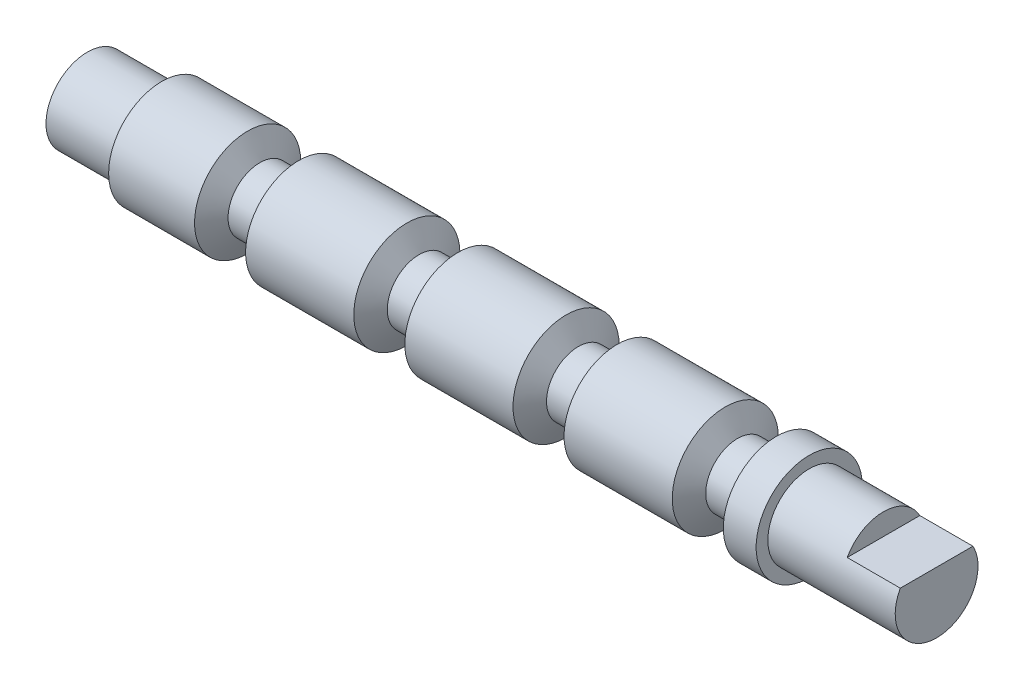
ISO-10303-21;
HEADER;
FILE_DESCRIPTION(('STEP AP214'),'2;1');
FILE_NAME('part.step','',(''),(''),'','','');
FILE_SCHEMA(('AUTOMOTIVE_DESIGN { 1 0 10303 214 1 1 1 1 }'));
ENDSEC;
DATA;
#1=APPLICATION_CONTEXT('core data for automotive mechanical design processes');
#2=APPLICATION_PROTOCOL_DEFINITION('international standard','automotive_design',2000,#1);
#3=PRODUCT_CONTEXT('',#1,'mechanical');
#4=PRODUCT('Part','Part','',(#3));
#5=PRODUCT_RELATED_PRODUCT_CATEGORY('part','',(#4));
#6=PRODUCT_DEFINITION_FORMATION('','',#4);
#7=PRODUCT_DEFINITION_CONTEXT('part definition',#1,'design');
#8=PRODUCT_DEFINITION('design','',#6,#7);
#9=PRODUCT_DEFINITION_SHAPE('','',#8);
#10=(LENGTH_UNIT() NAMED_UNIT(*) SI_UNIT(.MILLI.,.METRE.));
#11=(NAMED_UNIT(*) PLANE_ANGLE_UNIT() SI_UNIT($,.RADIAN.));
#12=(NAMED_UNIT(*) SI_UNIT($,.STERADIAN.) SOLID_ANGLE_UNIT());
#13=UNCERTAINTY_MEASURE_WITH_UNIT(LENGTH_MEASURE(1.E-05),#10,'distance_accuracy_value','');
#14=(GEOMETRIC_REPRESENTATION_CONTEXT(3) GLOBAL_UNCERTAINTY_ASSIGNED_CONTEXT((#13)) GLOBAL_UNIT_ASSIGNED_CONTEXT((#10,
#11,#12)) REPRESENTATION_CONTEXT('',''));
#15=CARTESIAN_POINT('',(0.,0.,0.));
#16=DIRECTION('',(0.,0.,1.));
#17=DIRECTION('',(1.,0.,0.));
#18=AXIS2_PLACEMENT_3D('',#15,#16,#17);
#19=CARTESIAN_POINT('',(40.,0.,5.));
#20=DIRECTION('',(1.,0.,0.));
#21=DIRECTION('',(0.,0.,-1.));
#22=AXIS2_PLACEMENT_3D('',#19,#20,#21);
#23=CYLINDRICAL_SURFACE('',#22,5.00000000000008);
#24=CARTESIAN_POINT('',(24.9047005383793,0.,5.));
#25=DIRECTION('',(1.,0.,0.));
#26=DIRECTION('',(0.,0.,-1.));
#27=AXIS2_PLACEMENT_3D('',#24,#25,#26);
#28=CIRCLE('',#27,5.);
#29=CARTESIAN_POINT('',(24.9047005383793,0.,0.));
#30=VERTEX_POINT('',#29);
#31=EDGE_CURVE('E112',#30,#30,#28,.T.);
#32=ORIENTED_EDGE('',*,*,#31,.T.);
#33=EDGE_LOOP('',(#32));
#34=FACE_BOUND('',#33,.T.);
#35=CARTESIAN_POINT('',(28.,0.,5.));
#36=DIRECTION('',(1.,0.,0.));
#37=DIRECTION('',(0.,0.,-1.));
#38=AXIS2_PLACEMENT_3D('',#35,#36,#37);
#39=CIRCLE('',#38,5.00000000000016);
#40=CARTESIAN_POINT('',(28.,0.,-1.64798730217797E-13));
#41=VERTEX_POINT('',#40);
#42=EDGE_CURVE('E93',#41,#41,#39,.T.);
#43=ORIENTED_EDGE('',*,*,#42,.F.);
#44=EDGE_LOOP('',(#43));
#45=FACE_BOUND('',#44,.T.);
#46=ADVANCED_FACE('F45',(#34,#45),#23,.T.);
#47=CARTESIAN_POINT('',(40.,0.,5.));
#48=DIRECTION('',(1.,0.,0.));
#49=DIRECTION('',(0.,0.,-1.));
#50=AXIS2_PLACEMENT_3D('',#47,#48,#49);
#51=CYLINDRICAL_SURFACE('',#50,5.);
#52=CARTESIAN_POINT('',(-24.9047005383792,0.,5.00000000000001));
#53=DIRECTION('',(1.,0.,0.));
#54=DIRECTION('',(0.,0.,-1.));
#55=AXIS2_PLACEMENT_3D('',#52,#53,#54);
#56=CIRCLE('',#55,5.);
#57=CARTESIAN_POINT('',(-24.9047005383792,0.,0.));
#58=VERTEX_POINT('',#57);
#59=EDGE_CURVE('E11',#58,#58,#56,.T.);
#60=ORIENTED_EDGE('',*,*,#59,.F.);
#61=EDGE_LOOP('',(#60));
#62=FACE_BOUND('',#61,.T.);
#63=CARTESIAN_POINT('',(-33.,0.,5.00000000000001));
#64=DIRECTION('',(-1.,0.,0.));
#65=DIRECTION('',(0.,0.,1.));
#66=AXIS2_PLACEMENT_3D('',#63,#64,#65);
#67=CIRCLE('',#66,5.00000000000017);
#68=CARTESIAN_POINT('',(-33.,0.,10.0000000000002));
#69=VERTEX_POINT('',#68);
#70=EDGE_CURVE('E105',#69,#69,#67,.T.);
#71=ORIENTED_EDGE('',*,*,#70,.F.);
#72=EDGE_LOOP('',(#71));
#73=FACE_BOUND('',#72,.T.);
#74=ADVANCED_FACE('F176',(#62,#73),#51,.T.);
#75=CARTESIAN_POINT('',(-23.75,0.,5.00000000000001));
#76=DIRECTION('',(-1.,0.,0.));
#77=DIRECTION('',(0.,0.,1.));
#78=AXIS2_PLACEMENT_3D('',#75,#76,#77);
#79=CONICAL_SURFACE('',#78,3.,1.0471975511966);
#80=ORIENTED_EDGE('',*,*,#59,.T.);
#81=EDGE_LOOP('',(#80));
#82=FACE_BOUND('',#81,.T.);
#83=CARTESIAN_POINT('',(-23.75,0.,5.00000000000001));
#84=DIRECTION('',(1.,0.,0.));
#85=DIRECTION('',(0.,0.,-1.));
#86=AXIS2_PLACEMENT_3D('',#83,#84,#85);
#87=CIRCLE('',#86,3.);
#88=CARTESIAN_POINT('',(-23.75,0.,2.00000000000001));
#89=VERTEX_POINT('',#88);
#90=EDGE_CURVE('E54',#89,#89,#87,.T.);
#91=ORIENTED_EDGE('',*,*,#90,.F.);
#92=EDGE_LOOP('',(#91));
#93=FACE_BOUND('',#92,.T.);
#94=ADVANCED_FACE('F174',(#82,#93),#79,.T.);
#95=CARTESIAN_POINT('',(40.,0.,5.));
#96=DIRECTION('',(1.,0.,0.));
#97=DIRECTION('',(0.,0.,-1.));
#98=AXIS2_PLACEMENT_3D('',#95,#96,#97);
#99=CYLINDRICAL_SURFACE('',#98,3.);
#100=ORIENTED_EDGE('',*,*,#90,.T.);
#101=EDGE_LOOP('',(#100));
#102=FACE_BOUND('',#101,.T.);
#103=CARTESIAN_POINT('',(-21.25,0.,5.));
#104=DIRECTION('',(1.,0.,0.));
#105=DIRECTION('',(0.,0.,-1.));
#106=AXIS2_PLACEMENT_3D('',#103,#104,#105);
#107=CIRCLE('',#106,3.);
#108=CARTESIAN_POINT('',(-21.25,0.,2.));
#109=VERTEX_POINT('',#108);
#110=EDGE_CURVE('E164',#109,#109,#107,.T.);
#111=ORIENTED_EDGE('',*,*,#110,.F.);
#112=EDGE_LOOP('',(#111));
#113=FACE_BOUND('',#112,.T.);
#114=ADVANCED_FACE('F171',(#102,#113),#99,.T.);
#115=CARTESIAN_POINT('',(-20.0952994616208,0.,5.));
#116=DIRECTION('',(1.,0.,0.));
#117=DIRECTION('',(0.,0.,-1.));
#118=AXIS2_PLACEMENT_3D('',#115,#116,#117);
#119=CONICAL_SURFACE('',#118,5.,1.0471975511966);
#120=ORIENTED_EDGE('',*,*,#110,.T.);
#121=EDGE_LOOP('',(#120));
#122=FACE_BOUND('',#121,.T.);
#123=CARTESIAN_POINT('',(-20.0952994616208,0.,5.));
#124=DIRECTION('',(1.,0.,0.));
#125=DIRECTION('',(0.,0.,-1.));
#126=AXIS2_PLACEMENT_3D('',#123,#124,#125);
#127=CIRCLE('',#126,5.);
#128=CARTESIAN_POINT('',(-20.0952994616208,0.,0.));
#129=VERTEX_POINT('',#128);
#130=EDGE_CURVE('E160',#129,#129,#127,.T.);
#131=ORIENTED_EDGE('',*,*,#130,.F.);
#132=EDGE_LOOP('',(#131));
#133=FACE_BOUND('',#132,.T.);
#134=ADVANCED_FACE('F182',(#122,#133),#119,.T.);
#135=CARTESIAN_POINT('',(40.,0.,5.));
#136=DIRECTION('',(1.,0.,0.));
#137=DIRECTION('',(0.,0.,-1.));
#138=AXIS2_PLACEMENT_3D('',#135,#136,#137);
#139=CYLINDRICAL_SURFACE('',#138,5.);
#140=ORIENTED_EDGE('',*,*,#130,.T.);
#141=EDGE_LOOP('',(#140));
#142=FACE_BOUND('',#141,.T.);
#143=CARTESIAN_POINT('',(-9.90470053837923,0.,5.));
#144=DIRECTION('',(1.,0.,0.));
#145=DIRECTION('',(0.,0.,-1.));
#146=AXIS2_PLACEMENT_3D('',#143,#144,#145);
#147=CIRCLE('',#146,5.);
#148=CARTESIAN_POINT('',(-9.90470053837923,0.,0.));
#149=VERTEX_POINT('',#148);
#150=EDGE_CURVE('E156',#149,#149,#147,.T.);
#151=ORIENTED_EDGE('',*,*,#150,.F.);
#152=EDGE_LOOP('',(#151));
#153=FACE_BOUND('',#152,.T.);
#154=ADVANCED_FACE('F241',(#142,#153),#139,.T.);
#155=CARTESIAN_POINT('',(-8.74999999999998,0.,5.));
#156=DIRECTION('',(-1.,0.,0.));
#157=DIRECTION('',(0.,0.,1.));
#158=AXIS2_PLACEMENT_3D('',#155,#156,#157);
#159=CONICAL_SURFACE('',#158,3.,1.0471975511966);
#160=ORIENTED_EDGE('',*,*,#150,.T.);
#161=EDGE_LOOP('',(#160));
#162=FACE_BOUND('',#161,.T.);
#163=CARTESIAN_POINT('',(-8.74999999999998,0.,5.));
#164=DIRECTION('',(1.,0.,0.));
#165=DIRECTION('',(0.,0.,-1.));
#166=AXIS2_PLACEMENT_3D('',#163,#164,#165);
#167=CIRCLE('',#166,3.);
#168=CARTESIAN_POINT('',(-8.74999999999998,0.,2.));
#169=VERTEX_POINT('',#168);
#170=EDGE_CURVE('E152',#169,#169,#167,.T.);
#171=ORIENTED_EDGE('',*,*,#170,.F.);
#172=EDGE_LOOP('',(#171));
#173=FACE_BOUND('',#172,.T.);
#174=ADVANCED_FACE('F237',(#162,#173),#159,.T.);
#175=CARTESIAN_POINT('',(40.,0.,5.));
#176=DIRECTION('',(1.,0.,0.));
#177=DIRECTION('',(0.,0.,-1.));
#178=AXIS2_PLACEMENT_3D('',#175,#176,#177);
#179=CYLINDRICAL_SURFACE('',#178,3.);
#180=ORIENTED_EDGE('',*,*,#170,.T.);
#181=EDGE_LOOP('',(#180));
#182=FACE_BOUND('',#181,.T.);
#183=CARTESIAN_POINT('',(-6.24999999999998,0.,5.));
#184=DIRECTION('',(1.,0.,0.));
#185=DIRECTION('',(0.,0.,-1.));
#186=AXIS2_PLACEMENT_3D('',#183,#184,#185);
#187=CIRCLE('',#186,3.);
#188=CARTESIAN_POINT('',(-6.24999999999998,0.,2.));
#189=VERTEX_POINT('',#188);
#190=EDGE_CURVE('E148',#189,#189,#187,.T.);
#191=ORIENTED_EDGE('',*,*,#190,.F.);
#192=EDGE_LOOP('',(#191));
#193=FACE_BOUND('',#192,.T.);
#194=ADVANCED_FACE('F233',(#182,#193),#179,.T.);
#195=CARTESIAN_POINT('',(-5.09529946162073,0.,5.));
#196=DIRECTION('',(1.,0.,0.));
#197=DIRECTION('',(0.,0.,-1.));
#198=AXIS2_PLACEMENT_3D('',#195,#196,#197);
#199=CONICAL_SURFACE('',#198,5.,1.0471975511966);
#200=ORIENTED_EDGE('',*,*,#190,.T.);
#201=EDGE_LOOP('',(#200));
#202=FACE_BOUND('',#201,.T.);
#203=CARTESIAN_POINT('',(-5.09529946162073,0.,5.));
#204=DIRECTION('',(1.,0.,0.));
#205=DIRECTION('',(0.,0.,-1.));
#206=AXIS2_PLACEMENT_3D('',#203,#204,#205);
#207=CIRCLE('',#206,5.);
#208=CARTESIAN_POINT('',(-5.09529946162073,0.,0.));
#209=VERTEX_POINT('',#208);
#210=EDGE_CURVE('E144',#209,#209,#207,.T.);
#211=ORIENTED_EDGE('',*,*,#210,.F.);
#212=EDGE_LOOP('',(#211));
#213=FACE_BOUND('',#212,.T.);
#214=ADVANCED_FACE('F229',(#202,#213),#199,.T.);
#215=CARTESIAN_POINT('',(40.,0.,5.));
#216=DIRECTION('',(1.,0.,0.));
#217=DIRECTION('',(0.,0.,-1.));
#218=AXIS2_PLACEMENT_3D('',#215,#216,#217);
#219=CYLINDRICAL_SURFACE('',#218,5.);
#220=ORIENTED_EDGE('',*,*,#210,.T.);
#221=EDGE_LOOP('',(#220));
#222=FACE_BOUND('',#221,.T.);
#223=CARTESIAN_POINT('',(5.09529946162073,0.,5.));
#224=DIRECTION('',(1.,0.,0.));
#225=DIRECTION('',(0.,0.,-1.));
#226=AXIS2_PLACEMENT_3D('',#223,#224,#225);
#227=CIRCLE('',#226,5.);
#228=CARTESIAN_POINT('',(5.09529946162073,0.,0.));
#229=VERTEX_POINT('',#228);
#230=EDGE_CURVE('E140',#229,#229,#227,.T.);
#231=ORIENTED_EDGE('',*,*,#230,.F.);
#232=EDGE_LOOP('',(#231));
#233=FACE_BOUND('',#232,.T.);
#234=ADVANCED_FACE('F225',(#222,#233),#219,.T.);
#235=CARTESIAN_POINT('',(6.24999999999998,0.,5.));
#236=DIRECTION('',(-1.,0.,0.));
#237=DIRECTION('',(0.,0.,1.));
#238=AXIS2_PLACEMENT_3D('',#235,#236,#237);
#239=CONICAL_SURFACE('',#238,3.,1.0471975511966);
#240=ORIENTED_EDGE('',*,*,#230,.T.);
#241=EDGE_LOOP('',(#240));
#242=FACE_BOUND('',#241,.T.);
#243=CARTESIAN_POINT('',(6.24999999999998,0.,5.));
#244=DIRECTION('',(1.,0.,0.));
#245=DIRECTION('',(0.,0.,-1.));
#246=AXIS2_PLACEMENT_3D('',#243,#244,#245);
#247=CIRCLE('',#246,3.);
#248=CARTESIAN_POINT('',(6.24999999999998,0.,2.));
#249=VERTEX_POINT('',#248);
#250=EDGE_CURVE('E136',#249,#249,#247,.T.);
#251=ORIENTED_EDGE('',*,*,#250,.F.);
#252=EDGE_LOOP('',(#251));
#253=FACE_BOUND('',#252,.T.);
#254=ADVANCED_FACE('F221',(#242,#253),#239,.T.);
#255=CARTESIAN_POINT('',(40.,0.,5.));
#256=DIRECTION('',(1.,0.,0.));
#257=DIRECTION('',(0.,0.,-1.));
#258=AXIS2_PLACEMENT_3D('',#255,#256,#257);
#259=CYLINDRICAL_SURFACE('',#258,3.);
#260=ORIENTED_EDGE('',*,*,#250,.T.);
#261=EDGE_LOOP('',(#260));
#262=FACE_BOUND('',#261,.T.);
#263=CARTESIAN_POINT('',(8.74999999999998,0.,5.));
#264=DIRECTION('',(1.,0.,0.));
#265=DIRECTION('',(0.,0.,-1.));
#266=AXIS2_PLACEMENT_3D('',#263,#264,#265);
#267=CIRCLE('',#266,3.);
#268=CARTESIAN_POINT('',(8.74999999999998,0.,2.));
#269=VERTEX_POINT('',#268);
#270=EDGE_CURVE('E132',#269,#269,#267,.T.);
#271=ORIENTED_EDGE('',*,*,#270,.F.);
#272=EDGE_LOOP('',(#271));
#273=FACE_BOUND('',#272,.T.);
#274=ADVANCED_FACE('F217',(#262,#273),#259,.T.);
#275=CARTESIAN_POINT('',(9.90470053837923,0.,5.));
#276=DIRECTION('',(1.,0.,0.));
#277=DIRECTION('',(0.,0.,-1.));
#278=AXIS2_PLACEMENT_3D('',#275,#276,#277);
#279=CONICAL_SURFACE('',#278,5.,1.0471975511966);
#280=ORIENTED_EDGE('',*,*,#270,.T.);
#281=EDGE_LOOP('',(#280));
#282=FACE_BOUND('',#281,.T.);
#283=CARTESIAN_POINT('',(9.90470053837923,0.,5.));
#284=DIRECTION('',(1.,0.,0.));
#285=DIRECTION('',(0.,0.,-1.));
#286=AXIS2_PLACEMENT_3D('',#283,#284,#285);
#287=CIRCLE('',#286,5.);
#288=CARTESIAN_POINT('',(9.90470053837923,0.,0.));
#289=VERTEX_POINT('',#288);
#290=EDGE_CURVE('E128',#289,#289,#287,.T.);
#291=ORIENTED_EDGE('',*,*,#290,.F.);
#292=EDGE_LOOP('',(#291));
#293=FACE_BOUND('',#292,.T.);
#294=ADVANCED_FACE('F213',(#282,#293),#279,.T.);
#295=CARTESIAN_POINT('',(40.,0.,5.));
#296=DIRECTION('',(1.,0.,0.));
#297=DIRECTION('',(0.,0.,-1.));
#298=AXIS2_PLACEMENT_3D('',#295,#296,#297);
#299=CYLINDRICAL_SURFACE('',#298,5.);
#300=ORIENTED_EDGE('',*,*,#290,.T.);
#301=EDGE_LOOP('',(#300));
#302=FACE_BOUND('',#301,.T.);
#303=CARTESIAN_POINT('',(20.0952994616208,0.,5.));
#304=DIRECTION('',(1.,0.,0.));
#305=DIRECTION('',(0.,0.,-1.));
#306=AXIS2_PLACEMENT_3D('',#303,#304,#305);
#307=CIRCLE('',#306,5.);
#308=CARTESIAN_POINT('',(20.0952994616208,0.,0.));
#309=VERTEX_POINT('',#308);
#310=EDGE_CURVE('E124',#309,#309,#307,.T.);
#311=ORIENTED_EDGE('',*,*,#310,.F.);
#312=EDGE_LOOP('',(#311));
#313=FACE_BOUND('',#312,.T.);
#314=ADVANCED_FACE('F209',(#302,#313),#299,.T.);
#315=CARTESIAN_POINT('',(21.25,0.,5.));
#316=DIRECTION('',(-1.,0.,0.));
#317=DIRECTION('',(0.,0.,1.));
#318=AXIS2_PLACEMENT_3D('',#315,#316,#317);
#319=CONICAL_SURFACE('',#318,3.,1.0471975511966);
#320=ORIENTED_EDGE('',*,*,#310,.T.);
#321=EDGE_LOOP('',(#320));
#322=FACE_BOUND('',#321,.T.);
#323=CARTESIAN_POINT('',(21.25,0.,5.));
#324=DIRECTION('',(1.,0.,0.));
#325=DIRECTION('',(0.,0.,-1.));
#326=AXIS2_PLACEMENT_3D('',#323,#324,#325);
#327=CIRCLE('',#326,3.);
#328=CARTESIAN_POINT('',(21.25,0.,2.));
#329=VERTEX_POINT('',#328);
#330=EDGE_CURVE('E120',#329,#329,#327,.T.);
#331=ORIENTED_EDGE('',*,*,#330,.F.);
#332=EDGE_LOOP('',(#331));
#333=FACE_BOUND('',#332,.T.);
#334=ADVANCED_FACE('F205',(#322,#333),#319,.T.);
#335=CARTESIAN_POINT('',(40.,0.,5.));
#336=DIRECTION('',(1.,0.,0.));
#337=DIRECTION('',(0.,0.,-1.));
#338=AXIS2_PLACEMENT_3D('',#335,#336,#337);
#339=CYLINDRICAL_SURFACE('',#338,3.);
#340=ORIENTED_EDGE('',*,*,#330,.T.);
#341=EDGE_LOOP('',(#340));
#342=FACE_BOUND('',#341,.T.);
#343=CARTESIAN_POINT('',(23.75,0.,5.));
#344=DIRECTION('',(1.,0.,0.));
#345=DIRECTION('',(0.,0.,-1.));
#346=AXIS2_PLACEMENT_3D('',#343,#344,#345);
#347=CIRCLE('',#346,3.);
#348=CARTESIAN_POINT('',(23.75,0.,2.));
#349=VERTEX_POINT('',#348);
#350=EDGE_CURVE('E116',#349,#349,#347,.T.);
#351=ORIENTED_EDGE('',*,*,#350,.F.);
#352=EDGE_LOOP('',(#351));
#353=FACE_BOUND('',#352,.T.);
#354=ADVANCED_FACE('F201',(#342,#353),#339,.T.);
#355=CARTESIAN_POINT('',(24.9047005383793,0.,5.));
#356=DIRECTION('',(1.,0.,0.));
#357=DIRECTION('',(0.,0.,-1.));
#358=AXIS2_PLACEMENT_3D('',#355,#356,#357);
#359=CONICAL_SURFACE('',#358,5.,1.0471975511966);
#360=ORIENTED_EDGE('',*,*,#350,.T.);
#361=EDGE_LOOP('',(#360));
#362=FACE_BOUND('',#361,.T.);
#363=ORIENTED_EDGE('',*,*,#31,.F.);
#364=EDGE_LOOP('',(#363));
#365=FACE_BOUND('',#364,.T.);
#366=ADVANCED_FACE('F197',(#362,#365),#359,.T.);
#367=CARTESIAN_POINT('',(-33.,0.,5.00000000000001));
#368=DIRECTION('',(-1.,0.,0.));
#369=DIRECTION('',(0.,0.,1.));
#370=AXIS2_PLACEMENT_3D('',#367,#368,#369);
#371=PLANE('',#370);
#372=CARTESIAN_POINT('',(-33.,0.,5.00000000000001));
#373=DIRECTION('',(-1.,0.,0.));
#374=DIRECTION('',(0.,0.,1.));
#375=AXIS2_PLACEMENT_3D('',#372,#373,#374);
#376=CIRCLE('',#375,3.9);
#377=CARTESIAN_POINT('',(-33.,0.,8.90000000000001));
#378=VERTEX_POINT('',#377);
#379=EDGE_CURVE('E101',#378,#378,#376,.T.);
#380=ORIENTED_EDGE('',*,*,#379,.F.);
#381=EDGE_LOOP('',(#380));
#382=FACE_BOUND('',#381,.T.);
#383=ORIENTED_EDGE('',*,*,#70,.T.);
#384=EDGE_LOOP('',(#383));
#385=FACE_BOUND('',#384,.T.);
#386=ADVANCED_FACE('F200',(#382,#385),#371,.T.);
#387=CARTESIAN_POINT('',(-33.,0.,5.00000000000001));
#388=DIRECTION('',(-1.,0.,0.));
#389=DIRECTION('',(0.,0.,1.));
#390=AXIS2_PLACEMENT_3D('',#387,#388,#389);
#391=CYLINDRICAL_SURFACE('',#390,3.9);
#392=CARTESIAN_POINT('',(-40.,0.,5.00000000000001));
#393=DIRECTION('',(-1.,0.,0.));
#394=DIRECTION('',(0.,0.,1.));
#395=AXIS2_PLACEMENT_3D('',#392,#393,#394);
#396=CIRCLE('',#395,3.9);
#397=CARTESIAN_POINT('',(-40.,0.,8.90000000000001));
#398=VERTEX_POINT('',#397);
#399=EDGE_CURVE('E100',#398,#398,#396,.T.);
#400=CARTESIAN_POINT('',(-33.,0.,8.90000000000001));
#401=CARTESIAN_POINT('',(-33.0729166666667,0.,8.90000000000001));
#402=CARTESIAN_POINT('',(-33.1458333333333,0.,8.90000000000001));
#403=CARTESIAN_POINT('',(-33.2916666666667,0.,8.90000000000001));
#404=CARTESIAN_POINT('',(-33.3645833333333,0.,8.90000000000001));
#405=CARTESIAN_POINT('',(-33.5104166666667,0.,8.90000000000001));
#406=CARTESIAN_POINT('',(-33.5833333333333,0.,8.90000000000001));
#407=CARTESIAN_POINT('',(-33.7291666666667,0.,8.90000000000001));
#408=CARTESIAN_POINT('',(-33.8020833333333,0.,8.90000000000001));
#409=CARTESIAN_POINT('',(-33.9479166666667,0.,8.90000000000001));
#410=CARTESIAN_POINT('',(-34.0208333333333,0.,8.90000000000001));
#411=CARTESIAN_POINT('',(-34.1666666666667,0.,8.90000000000001));
#412=CARTESIAN_POINT('',(-34.2395833333333,0.,8.90000000000001));
#413=CARTESIAN_POINT('',(-34.3854166666667,0.,8.90000000000001));
#414=CARTESIAN_POINT('',(-34.4583333333333,0.,8.90000000000001));
#415=CARTESIAN_POINT('',(-34.6041666666667,0.,8.90000000000001));
#416=CARTESIAN_POINT('',(-34.6770833333333,0.,8.90000000000001));
#417=CARTESIAN_POINT('',(-34.8229166666667,0.,8.90000000000001));
#418=CARTESIAN_POINT('',(-34.8958333333333,0.,8.90000000000001));
#419=CARTESIAN_POINT('',(-35.0416666666667,0.,8.90000000000001));
#420=CARTESIAN_POINT('',(-35.1145833333333,0.,8.90000000000001));
#421=CARTESIAN_POINT('',(-35.2604166666667,0.,8.90000000000001));
#422=CARTESIAN_POINT('',(-35.3333333333333,0.,8.90000000000001));
#423=CARTESIAN_POINT('',(-35.4791666666667,0.,8.90000000000001));
#424=CARTESIAN_POINT('',(-35.5520833333333,0.,8.90000000000001));
#425=CARTESIAN_POINT('',(-35.6979166666667,0.,8.90000000000001));
#426=CARTESIAN_POINT('',(-35.7708333333333,0.,8.90000000000001));
#427=CARTESIAN_POINT('',(-35.9166666666667,0.,8.90000000000001));
#428=CARTESIAN_POINT('',(-35.9895833333333,0.,8.90000000000001));
#429=CARTESIAN_POINT('',(-36.1354166666667,0.,8.90000000000001));
#430=CARTESIAN_POINT('',(-36.2083333333333,0.,8.90000000000001));
#431=CARTESIAN_POINT('',(-36.3541666666667,0.,8.90000000000001));
#432=CARTESIAN_POINT('',(-36.4270833333333,0.,8.90000000000001));
#433=CARTESIAN_POINT('',(-36.5729166666667,0.,8.90000000000001));
#434=CARTESIAN_POINT('',(-36.6458333333333,0.,8.90000000000001));
#435=CARTESIAN_POINT('',(-36.7916666666667,0.,8.90000000000001));
#436=CARTESIAN_POINT('',(-36.8645833333333,0.,8.90000000000001));
#437=CARTESIAN_POINT('',(-37.0104166666667,0.,8.90000000000001));
#438=CARTESIAN_POINT('',(-37.0833333333333,0.,8.90000000000001));
#439=CARTESIAN_POINT('',(-37.2291666666667,0.,8.90000000000001));
#440=CARTESIAN_POINT('',(-37.3020833333333,0.,8.90000000000001));
#441=CARTESIAN_POINT('',(-37.4479166666667,0.,8.90000000000001));
#442=CARTESIAN_POINT('',(-37.5208333333333,0.,8.90000000000001));
#443=CARTESIAN_POINT('',(-37.6666666666667,0.,8.90000000000001));
#444=CARTESIAN_POINT('',(-37.7395833333333,0.,8.90000000000001));
#445=CARTESIAN_POINT('',(-37.8854166666667,0.,8.90000000000001));
#446=CARTESIAN_POINT('',(-37.9583333333333,0.,8.90000000000001));
#447=CARTESIAN_POINT('',(-38.1041666666667,0.,8.90000000000001));
#448=CARTESIAN_POINT('',(-38.1770833333333,0.,8.90000000000001));
#449=CARTESIAN_POINT('',(-38.3229166666667,0.,8.90000000000001));
#450=CARTESIAN_POINT('',(-38.3958333333333,0.,8.90000000000001));
#451=CARTESIAN_POINT('',(-38.5416666666667,0.,8.90000000000001));
#452=CARTESIAN_POINT('',(-38.6145833333333,0.,8.90000000000001));
#453=CARTESIAN_POINT('',(-38.7604166666667,0.,8.90000000000001));
#454=CARTESIAN_POINT('',(-38.8333333333333,0.,8.90000000000001));
#455=CARTESIAN_POINT('',(-38.9791666666667,0.,8.90000000000001));
#456=CARTESIAN_POINT('',(-39.0520833333333,0.,8.90000000000001));
#457=CARTESIAN_POINT('',(-39.1979166666667,0.,8.90000000000001));
#458=CARTESIAN_POINT('',(-39.2708333333333,0.,8.90000000000001));
#459=CARTESIAN_POINT('',(-39.4166666666667,0.,8.90000000000001));
#460=CARTESIAN_POINT('',(-39.4895833333333,0.,8.90000000000001));
#461=CARTESIAN_POINT('',(-39.6354166666667,0.,8.90000000000001));
#462=CARTESIAN_POINT('',(-39.7083333333333,0.,8.90000000000001));
#463=CARTESIAN_POINT('',(-39.8541666666667,0.,8.90000000000001));
#464=CARTESIAN_POINT('',(-39.9270833333333,0.,8.90000000000001));
#465=CARTESIAN_POINT('',(-40.,0.,8.90000000000001));
#466=B_SPLINE_CURVE_WITH_KNOTS('',3,(#400,#401,#402,#403,#404,#405,#406,#407,#408,#409,#410,
#411,#412,#413,#414,#415,#416,#417,#418,#419,#420,#421,#422,#423,#424,#425,#426,#427,#428,#429,
#430,#431,#432,#433,#434,#435,#436,#437,#438,#439,#440,#441,#442,#443,#444,#445,#446,#447,#448,
#449,#450,#451,#452,#453,#454,#455,#456,#457,#458,#459,#460,#461,#462,#463,#464,#465),
.UNSPECIFIED.,.F.,.F.,(4,2,2,2,2,2,2,2,2,2,2,2,2,2,2,2,2,2,2,2,2,2,2,2,2,2,2,2,2,2,2,2,4),(0.,
0.218749999999997,0.437499999999993,0.656249999999997,0.874999999999994,1.09375,
1.31249999999999,1.53125,1.74999999999999,1.96875,2.1875,2.40625,2.625,2.84375,3.0625,
3.28124999999999,3.5,3.71874999999999,3.9375,4.15624999999999,4.375,4.59374999999999,4.8125,
5.03124999999999,5.25,5.46874999999999,5.6875,5.90624999999999,6.125,6.34375,6.56249999999999,
6.78125,6.99999999999999),.UNSPECIFIED.);
#467=EDGE_CURVE('BSEAM352',#378,#398,#466,.T.);
#468=ORIENTED_EDGE('',*,*,#379,.T.);
#469=ORIENTED_EDGE('',*,*,#399,.F.);
#470=ORIENTED_EDGE('',*,*,#467,.T.);
#471=ORIENTED_EDGE('',*,*,#467,.F.);
#472=EDGE_LOOP('',(#468,#470,#469,#471));
#473=FACE_BOUND('',#472,.T.);
#474=ADVANCED_FACE('F352',(#473),#391,.T.);
#475=CARTESIAN_POINT('',(-40.,0.,-1.57067999254052E-13));
#476=DIRECTION('',(-1.,0.,0.));
#477=DIRECTION('',(0.,0.,1.));
#478=AXIS2_PLACEMENT_3D('',#475,#476,#477);
#479=PLANE('',#478);
#480=ORIENTED_EDGE('',*,*,#399,.T.);
#481=EDGE_LOOP('',(#480));
#482=FACE_BOUND('',#481,.T.);
#483=ADVANCED_FACE('F47',(#482),#479,.T.);
#484=CARTESIAN_POINT('',(28.,0.,5.));
#485=DIRECTION('',(1.,0.,0.));
#486=DIRECTION('',(0.,0.,-1.));
#487=AXIS2_PLACEMENT_3D('',#484,#485,#486);
#488=PLANE('',#487);
#489=CARTESIAN_POINT('',(28.,0.,5.));
#490=DIRECTION('',(1.,0.,0.));
#491=DIRECTION('',(0.,0.,-1.));
#492=AXIS2_PLACEMENT_3D('',#489,#490,#491);
#493=CIRCLE('',#492,3.9);
#494=CARTESIAN_POINT('',(28.,0.,1.1));
#495=VERTEX_POINT('',#494);
#496=EDGE_CURVE('E89',#495,#495,#493,.T.);
#497=ORIENTED_EDGE('',*,*,#496,.F.);
#498=EDGE_LOOP('',(#497));
#499=FACE_BOUND('',#498,.T.);
#500=ORIENTED_EDGE('',*,*,#42,.T.);
#501=EDGE_LOOP('',(#500));
#502=FACE_BOUND('',#501,.T.);
#503=ADVANCED_FACE('F367',(#499,#502),#488,.T.);
#504=CARTESIAN_POINT('',(28.,0.,5.));
#505=DIRECTION('',(1.,0.,0.));
#506=DIRECTION('',(0.,0.,-1.));
#507=AXIS2_PLACEMENT_3D('',#504,#505,#506);
#508=CYLINDRICAL_SURFACE('',#507,3.9);
#509=DIRECTION('',(1.,0.,0.));
#510=VECTOR('',#509,1.);
#511=CARTESIAN_POINT('',(35.,1.87085807792032,1.57802833847498));
#512=LINE('',#511,#510);
#513=CARTESIAN_POINT('',(35.,1.87085807792032,1.57802833847498));
#514=VERTEX_POINT('',#513);
#515=CARTESIAN_POINT('',(40.,1.87085807792032,1.57802833847498));
#516=VERTEX_POINT('',#515);
#517=EDGE_CURVE('E67',#514,#516,#512,.T.);
#518=ORIENTED_EDGE('',*,*,#517,.T.);
#519=CARTESIAN_POINT('',(40.,0.,5.));
#520=DIRECTION('',(1.,0.,0.));
#521=DIRECTION('',(0.,0.,-1.));
#522=AXIS2_PLACEMENT_3D('',#519,#520,#521);
#523=CIRCLE('',#522,3.9);
#524=CARTESIAN_POINT('',(40.,1.87085807792032,8.42197166152502));
#525=VERTEX_POINT('',#524);
#526=EDGE_CURVE('E84',#525,#516,#523,.T.);
#527=ORIENTED_EDGE('',*,*,#526,.F.);
#528=DIRECTION('',(1.,0.,0.));
#529=VECTOR('',#528,1.);
#530=CARTESIAN_POINT('',(35.,1.87085807792032,8.42197166152501));
#531=LINE('',#530,#529);
#532=CARTESIAN_POINT('',(35.,1.87085807792032,8.42197166152501));
#533=VERTEX_POINT('',#532);
#534=EDGE_CURVE('E61',#533,#525,#531,.T.);
#535=ORIENTED_EDGE('',*,*,#534,.F.);
#536=CARTESIAN_POINT('',(35.,0.,5.));
#537=DIRECTION('',(1.,0.,0.));
#538=DIRECTION('',(0.,0.,-1.));
#539=AXIS2_PLACEMENT_3D('',#536,#537,#538);
#540=CIRCLE('',#539,3.9);
#541=EDGE_CURVE('E78',#514,#533,#540,.T.);
#542=ORIENTED_EDGE('',*,*,#541,.F.);
#543=EDGE_LOOP('',(#518,#527,#535,#542));
#544=FACE_BOUND('',#543,.T.);
#545=ORIENTED_EDGE('',*,*,#496,.T.);
#546=EDGE_LOOP('',(#545));
#547=FACE_BOUND('',#546,.T.);
#548=ADVANCED_FACE('F82',(#544,#547),#508,.T.);
#549=CARTESIAN_POINT('',(40.,0.,-1.66865173647231E-13));
#550=DIRECTION('',(1.,0.,0.));
#551=DIRECTION('',(0.,0.,-1.));
#552=AXIS2_PLACEMENT_3D('',#549,#550,#551);
#553=PLANE('',#552);
#554=DIRECTION('',(0.,0.,-1.));
#555=VECTOR('',#554,1.);
#556=CARTESIAN_POINT('',(40.,1.87085807792032,8.42197166152501));
#557=LINE('',#556,#555);
#558=EDGE_CURVE('E72',#525,#516,#557,.T.);
#559=ORIENTED_EDGE('',*,*,#558,.F.);
#560=ORIENTED_EDGE('',*,*,#526,.T.);
#561=EDGE_LOOP('',(#559,#560));
#562=FACE_BOUND('',#561,.T.);
#563=ADVANCED_FACE('F87',(#562),#553,.T.);
#564=CARTESIAN_POINT('',(35.,1.87085807792032,8.42197166152501));
#565=DIRECTION('',(0.,-1.,0.));
#566=DIRECTION('',(0.,0.,-1.));
#567=AXIS2_PLACEMENT_3D('',#564,#565,#566);
#568=PLANE('',#567);
#569=ORIENTED_EDGE('',*,*,#558,.T.);
#570=ORIENTED_EDGE('',*,*,#517,.F.);
#571=DIRECTION('',(0.,0.,-1.));
#572=VECTOR('',#571,1.);
#573=CARTESIAN_POINT('',(35.,1.87085807792032,8.42197166152501));
#574=LINE('',#573,#572);
#575=EDGE_CURVE('E417',#533,#514,#574,.T.);
#576=ORIENTED_EDGE('',*,*,#575,.F.);
#577=ORIENTED_EDGE('',*,*,#534,.T.);
#578=EDGE_LOOP('',(#569,#570,#576,#577));
#579=FACE_BOUND('',#578,.T.);
#580=ADVANCED_FACE('F73',(#579),#568,.F.);
#581=CARTESIAN_POINT('',(35.,0.,5.));
#582=DIRECTION('',(1.,0.,0.));
#583=DIRECTION('',(0.,0.,-1.));
#584=AXIS2_PLACEMENT_3D('',#581,#582,#583);
#585=PLANE('',#584);
#586=ORIENTED_EDGE('',*,*,#541,.T.);
#587=ORIENTED_EDGE('',*,*,#575,.T.);
#588=EDGE_LOOP('',(#586,#587));
#589=FACE_BOUND('',#588,.T.);
#590=ADVANCED_FACE('F404',(#589),#585,.T.);
#591=CLOSED_SHELL('',(#46,#74,#94,#114,#134,#154,#174,#194,#214,#234,#254,#274,#294,#314,#334,
#354,#366,#386,#474,#483,#503,#548,#563,#580,#590));
#592=MANIFOLD_SOLID_BREP('B2',#591);
#593=ADVANCED_BREP_SHAPE_REPRESENTATION('',(#18,#592),#14);
#594=SHAPE_DEFINITION_REPRESENTATION(#9,#593);
ENDSEC;
END-ISO-10303-21;
